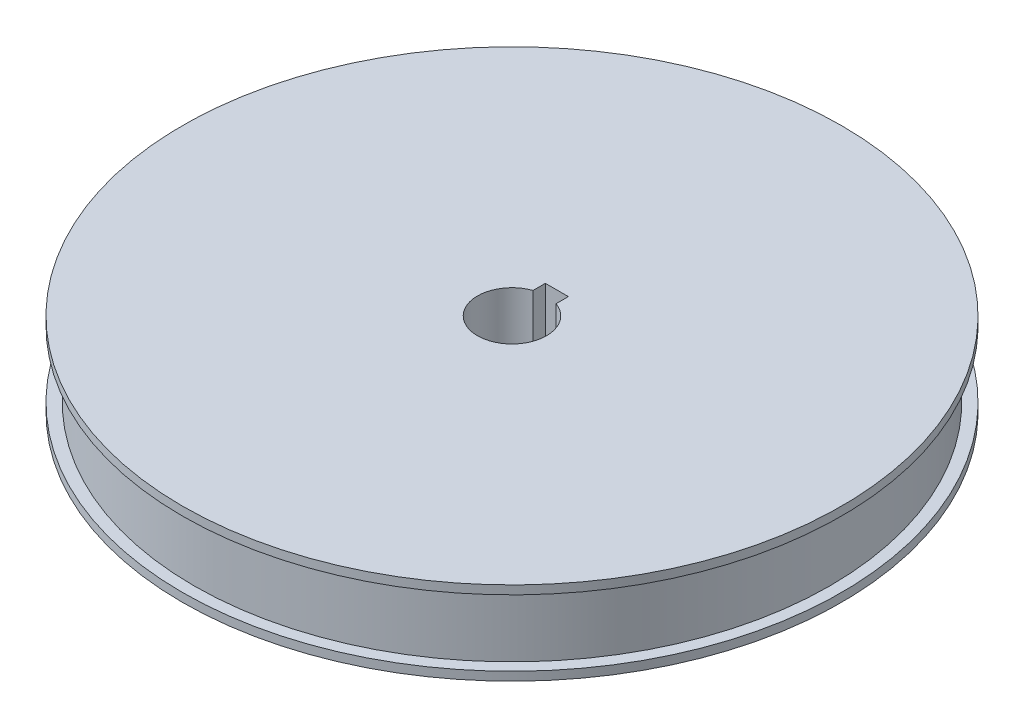
ISO-10303-21;
HEADER;
FILE_DESCRIPTION(('STEP AP214'),'2;1');
FILE_NAME('part.step','',(''),(''),'','','');
FILE_SCHEMA(('AUTOMOTIVE_DESIGN { 1 0 10303 214 1 1 1 1 }'));
ENDSEC;
DATA;
#1=APPLICATION_CONTEXT('core data for automotive mechanical design processes');
#2=APPLICATION_PROTOCOL_DEFINITION('international standard','automotive_design',2000,#1);
#3=PRODUCT_CONTEXT('',#1,'mechanical');
#4=PRODUCT('Part','Part','',(#3));
#5=PRODUCT_RELATED_PRODUCT_CATEGORY('part','',(#4));
#6=PRODUCT_DEFINITION_FORMATION('','',#4);
#7=PRODUCT_DEFINITION_CONTEXT('part definition',#1,'design');
#8=PRODUCT_DEFINITION('design','',#6,#7);
#9=PRODUCT_DEFINITION_SHAPE('','',#8);
#10=(LENGTH_UNIT() NAMED_UNIT(*) SI_UNIT(.MILLI.,.METRE.));
#11=(NAMED_UNIT(*) PLANE_ANGLE_UNIT() SI_UNIT($,.RADIAN.));
#12=(NAMED_UNIT(*) SI_UNIT($,.STERADIAN.) SOLID_ANGLE_UNIT());
#13=UNCERTAINTY_MEASURE_WITH_UNIT(LENGTH_MEASURE(1.E-05),#10,'distance_accuracy_value','');
#14=(GEOMETRIC_REPRESENTATION_CONTEXT(3) GLOBAL_UNCERTAINTY_ASSIGNED_CONTEXT((#13)) GLOBAL_UNIT_ASSIGNED_CONTEXT((#10,
#11,#12)) REPRESENTATION_CONTEXT('',''));
#15=CARTESIAN_POINT('',(0.,0.,0.));
#16=DIRECTION('',(0.,0.,1.));
#17=DIRECTION('',(1.,0.,0.));
#18=AXIS2_PLACEMENT_3D('',#15,#16,#17);
#19=CARTESIAN_POINT('',(0.,10.3155225102178,0.));
#20=DIRECTION('',(0.,1.,0.));
#21=DIRECTION('',(0.,0.,1.));
#22=AXIS2_PLACEMENT_3D('',#19,#20,#21);
#23=CYLINDRICAL_SURFACE('',#22,57.295);
#24=CARTESIAN_POINT('',(0.,-5.75,0.));
#25=DIRECTION('',(0.,1.,0.));
#26=DIRECTION('',(0.,0.,1.));
#27=AXIS2_PLACEMENT_3D('',#24,#25,#26);
#28=CIRCLE('',#27,57.295);
#29=CARTESIAN_POINT('',(0.,-5.75,57.295));
#30=VERTEX_POINT('',#29);
#31=EDGE_CURVE('E117',#30,#30,#28,.T.);
#32=ORIENTED_EDGE('',*,*,#31,.F.);
#33=EDGE_LOOP('',(#32));
#34=FACE_BOUND('',#33,.T.);
#35=CARTESIAN_POINT('',(0.,-7.25,0.));
#36=DIRECTION('',(0.,1.,0.));
#37=DIRECTION('',(0.,0.,1.));
#38=AXIS2_PLACEMENT_3D('',#35,#36,#37);
#39=CIRCLE('',#38,57.295);
#40=CARTESIAN_POINT('',(0.,-7.25,57.295));
#41=VERTEX_POINT('',#40);
#42=EDGE_CURVE('E47',#41,#41,#39,.T.);
#43=ORIENTED_EDGE('',*,*,#42,.T.);
#44=EDGE_LOOP('',(#43));
#45=FACE_BOUND('',#44,.T.);
#46=ADVANCED_FACE('F39',(#34,#45),#23,.T.);
#47=CARTESIAN_POINT('',(0.,-7.25,-57.295));
#48=DIRECTION('',(0.,1.,0.));
#49=DIRECTION('',(0.,0.,1.));
#50=AXIS2_PLACEMENT_3D('',#47,#48,#49);
#51=PLANE('',#50);
#52=ORIENTED_EDGE('',*,*,#42,.F.);
#53=EDGE_LOOP('',(#52));
#54=FACE_BOUND('',#53,.T.);
#55=DIRECTION('',(-1.,0.,0.));
#56=VECTOR('',#55,1.);
#57=CARTESIAN_POINT('',(-2.,-7.25,-7.79999999999999));
#58=LINE('',#57,#56);
#59=CARTESIAN_POINT('',(2.,-7.25,-7.79999999999999));
#60=VERTEX_POINT('',#59);
#61=CARTESIAN_POINT('',(-2.,-7.25,-7.79999999999999));
#62=VERTEX_POINT('',#61);
#63=EDGE_CURVE('E88',#60,#62,#58,.T.);
#64=ORIENTED_EDGE('',*,*,#63,.T.);
#65=DIRECTION('',(0.,0.,1.));
#66=VECTOR('',#65,1.);
#67=CARTESIAN_POINT('',(-2.,-7.25,-3.49999999999999));
#68=LINE('',#67,#66);
#69=CARTESIAN_POINT('',(-2.,-7.25,-5.65685424949238));
#70=VERTEX_POINT('',#69);
#71=EDGE_CURVE('E100',#62,#70,#68,.T.);
#72=ORIENTED_EDGE('',*,*,#71,.T.);
#73=CARTESIAN_POINT('',(0.,-7.24999999999999,0.));
#74=DIRECTION('',(0.,1.,0.));
#75=DIRECTION('',(0.,0.,1.));
#76=AXIS2_PLACEMENT_3D('',#73,#74,#75);
#77=CIRCLE('',#76,6.00000000000001);
#78=CARTESIAN_POINT('',(2.,-7.25,-5.65685424949238));
#79=VERTEX_POINT('',#78);
#80=EDGE_CURVE('E98',#70,#79,#77,.T.);
#81=ORIENTED_EDGE('',*,*,#80,.T.);
#82=DIRECTION('',(0.,0.,-1.));
#83=VECTOR('',#82,1.);
#84=CARTESIAN_POINT('',(2.,-7.25,-3.49999999999999));
#85=LINE('',#84,#83);
#86=EDGE_CURVE('E82',#79,#60,#85,.T.);
#87=ORIENTED_EDGE('',*,*,#86,.T.);
#88=EDGE_LOOP('',(#64,#72,#81,#87));
#89=FACE_BOUND('',#88,.T.);
#90=ADVANCED_FACE('F96',(#54,#89),#51,.F.);
#91=CARTESIAN_POINT('',(0.,10.3155225102178,0.));
#92=DIRECTION('',(0.,1.,0.));
#93=DIRECTION('',(0.,0.,1.));
#94=AXIS2_PLACEMENT_3D('',#91,#92,#93);
#95=CYLINDRICAL_SURFACE('',#94,6.00000000000001);
#96=ORIENTED_EDGE('',*,*,#80,.F.);
#97=DIRECTION('',(0.,1.,0.));
#98=VECTOR('',#97,1.);
#99=CARTESIAN_POINT('',(-2.,10.3155225102178,-5.65685424949238));
#100=LINE('',#99,#98);
#101=CARTESIAN_POINT('',(-2.,7.25,-5.65685424949238));
#102=VERTEX_POINT('',#101);
#103=EDGE_CURVE('E61',#70,#102,#100,.T.);
#104=ORIENTED_EDGE('',*,*,#103,.T.);
#105=CARTESIAN_POINT('',(0.,7.24999999999999,0.));
#106=DIRECTION('',(0.,1.,0.));
#107=DIRECTION('',(0.,0.,1.));
#108=AXIS2_PLACEMENT_3D('',#105,#106,#107);
#109=CIRCLE('',#108,6.00000000000001);
#110=CARTESIAN_POINT('',(2.,7.24999999999999,-5.65685424949238));
#111=VERTEX_POINT('',#110);
#112=EDGE_CURVE('E137',#102,#111,#109,.T.);
#113=ORIENTED_EDGE('',*,*,#112,.T.);
#114=DIRECTION('',(0.,1.,0.));
#115=VECTOR('',#114,1.);
#116=CARTESIAN_POINT('',(2.,10.3155225102178,-5.65685424949238));
#117=LINE('',#116,#115);
#118=EDGE_CURVE('E54',#111,#79,#117,.F.);
#119=ORIENTED_EDGE('',*,*,#118,.T.);
#120=EDGE_LOOP('',(#96,#104,#113,#119));
#121=FACE_BOUND('',#120,.T.);
#122=ADVANCED_FACE('F148',(#121),#95,.F.);
#123=CARTESIAN_POINT('',(0.,7.25,-57.295));
#124=DIRECTION('',(0.,-1.,0.));
#125=DIRECTION('',(0.,0.,-1.));
#126=AXIS2_PLACEMENT_3D('',#123,#124,#125);
#127=PLANE('',#126);
#128=ORIENTED_EDGE('',*,*,#112,.F.);
#129=DIRECTION('',(0.,0.,1.));
#130=VECTOR('',#129,1.);
#131=CARTESIAN_POINT('',(-2.,7.25,-3.49999999999999));
#132=LINE('',#131,#130);
#133=CARTESIAN_POINT('',(-2.,7.25,-7.79999999999999));
#134=VERTEX_POINT('',#133);
#135=EDGE_CURVE('E106',#134,#102,#132,.T.);
#136=ORIENTED_EDGE('',*,*,#135,.F.);
#137=DIRECTION('',(-1.,0.,0.));
#138=VECTOR('',#137,1.);
#139=CARTESIAN_POINT('',(-2.,7.25,-7.79999999999999));
#140=LINE('',#139,#138);
#141=CARTESIAN_POINT('',(2.,7.25,-7.79999999999999));
#142=VERTEX_POINT('',#141);
#143=EDGE_CURVE('E103',#142,#134,#140,.T.);
#144=ORIENTED_EDGE('',*,*,#143,.F.);
#145=DIRECTION('',(0.,0.,1.));
#146=VECTOR('',#145,1.);
#147=CARTESIAN_POINT('',(1.99999999999993,7.25,-57.295));
#148=LINE('',#147,#146);
#149=EDGE_CURVE('E11',#142,#111,#148,.T.);
#150=ORIENTED_EDGE('',*,*,#149,.T.);
#151=EDGE_LOOP('',(#128,#136,#144,#150));
#152=FACE_BOUND('',#151,.T.);
#153=CARTESIAN_POINT('',(0.,7.25,0.));
#154=DIRECTION('',(0.,1.,0.));
#155=DIRECTION('',(0.,0.,1.));
#156=AXIS2_PLACEMENT_3D('',#153,#154,#155);
#157=CIRCLE('',#156,57.295);
#158=CARTESIAN_POINT('',(0.,7.25,57.295));
#159=VERTEX_POINT('',#158);
#160=EDGE_CURVE('E133',#159,#159,#157,.T.);
#161=ORIENTED_EDGE('',*,*,#160,.T.);
#162=EDGE_LOOP('',(#161));
#163=FACE_BOUND('',#162,.T.);
#164=ADVANCED_FACE('F153',(#152,#163),#127,.F.);
#165=CARTESIAN_POINT('',(0.,10.3155225102178,0.));
#166=DIRECTION('',(0.,1.,0.));
#167=DIRECTION('',(0.,0.,1.));
#168=AXIS2_PLACEMENT_3D('',#165,#166,#167);
#169=CYLINDRICAL_SURFACE('',#168,57.295);
#170=ORIENTED_EDGE('',*,*,#160,.F.);
#171=EDGE_LOOP('',(#170));
#172=FACE_BOUND('',#171,.T.);
#173=CARTESIAN_POINT('',(0.,5.75,0.));
#174=DIRECTION('',(0.,1.,0.));
#175=DIRECTION('',(0.,0.,1.));
#176=AXIS2_PLACEMENT_3D('',#173,#174,#175);
#177=CIRCLE('',#176,57.295);
#178=CARTESIAN_POINT('',(0.,5.75,57.295));
#179=VERTEX_POINT('',#178);
#180=EDGE_CURVE('E129',#179,#179,#177,.T.);
#181=ORIENTED_EDGE('',*,*,#180,.T.);
#182=EDGE_LOOP('',(#181));
#183=FACE_BOUND('',#182,.T.);
#184=ADVANCED_FACE('F160',(#172,#183),#169,.T.);
#185=CARTESIAN_POINT('',(0.,5.75,-55.295));
#186=DIRECTION('',(0.,1.,0.));
#187=DIRECTION('',(0.,0.,1.));
#188=AXIS2_PLACEMENT_3D('',#185,#186,#187);
#189=PLANE('',#188);
#190=ORIENTED_EDGE('',*,*,#180,.F.);
#191=EDGE_LOOP('',(#190));
#192=FACE_BOUND('',#191,.T.);
#193=CARTESIAN_POINT('',(0.,5.75,0.));
#194=DIRECTION('',(0.,1.,0.));
#195=DIRECTION('',(0.,0.,1.));
#196=AXIS2_PLACEMENT_3D('',#193,#194,#195);
#197=CIRCLE('',#196,55.295);
#198=CARTESIAN_POINT('',(0.,5.75,55.295));
#199=VERTEX_POINT('',#198);
#200=EDGE_CURVE('E125',#199,#199,#197,.T.);
#201=ORIENTED_EDGE('',*,*,#200,.T.);
#202=EDGE_LOOP('',(#201));
#203=FACE_BOUND('',#202,.T.);
#204=ADVANCED_FACE('F164',(#192,#203),#189,.F.);
#205=CARTESIAN_POINT('',(0.,10.3155225102178,0.));
#206=DIRECTION('',(0.,1.,0.));
#207=DIRECTION('',(0.,0.,1.));
#208=AXIS2_PLACEMENT_3D('',#205,#206,#207);
#209=CYLINDRICAL_SURFACE('',#208,55.295);
#210=ORIENTED_EDGE('',*,*,#200,.F.);
#211=EDGE_LOOP('',(#210));
#212=FACE_BOUND('',#211,.T.);
#213=CARTESIAN_POINT('',(0.,-5.75,0.));
#214=DIRECTION('',(0.,1.,0.));
#215=DIRECTION('',(0.,0.,1.));
#216=AXIS2_PLACEMENT_3D('',#213,#214,#215);
#217=CIRCLE('',#216,55.295);
#218=CARTESIAN_POINT('',(0.,-5.75,55.295));
#219=VERTEX_POINT('',#218);
#220=EDGE_CURVE('E121',#219,#219,#217,.T.);
#221=ORIENTED_EDGE('',*,*,#220,.T.);
#222=EDGE_LOOP('',(#221));
#223=FACE_BOUND('',#222,.T.);
#224=ADVANCED_FACE('F168',(#212,#223),#209,.T.);
#225=CARTESIAN_POINT('',(0.,-5.75,-55.295));
#226=DIRECTION('',(0.,-1.,0.));
#227=DIRECTION('',(0.,0.,-1.));
#228=AXIS2_PLACEMENT_3D('',#225,#226,#227);
#229=PLANE('',#228);
#230=ORIENTED_EDGE('',*,*,#220,.F.);
#231=EDGE_LOOP('',(#230));
#232=FACE_BOUND('',#231,.T.);
#233=ORIENTED_EDGE('',*,*,#31,.T.);
#234=EDGE_LOOP('',(#233));
#235=FACE_BOUND('',#234,.T.);
#236=ADVANCED_FACE('F172',(#232,#235),#229,.F.);
#237=CARTESIAN_POINT('',(-2.,-7.25,-3.49999999999999));
#238=DIRECTION('',(-1.,0.,0.));
#239=DIRECTION('',(0.,0.,1.));
#240=AXIS2_PLACEMENT_3D('',#237,#238,#239);
#241=PLANE('',#240);
#242=ORIENTED_EDGE('',*,*,#71,.F.);
#243=DIRECTION('',(0.,1.,0.));
#244=VECTOR('',#243,1.);
#245=CARTESIAN_POINT('',(-2.,-7.25,-7.79999999999999));
#246=LINE('',#245,#244);
#247=EDGE_CURVE('E87',#62,#134,#246,.T.);
#248=ORIENTED_EDGE('',*,*,#247,.T.);
#249=ORIENTED_EDGE('',*,*,#135,.T.);
#250=ORIENTED_EDGE('',*,*,#103,.F.);
#251=EDGE_LOOP('',(#242,#248,#249,#250));
#252=FACE_BOUND('',#251,.T.);
#253=ADVANCED_FACE('F176',(#252),#241,.F.);
#254=CARTESIAN_POINT('',(2.,-7.25,-3.49999999999999));
#255=DIRECTION('',(1.,0.,0.));
#256=DIRECTION('',(0.,0.,-1.));
#257=AXIS2_PLACEMENT_3D('',#254,#255,#256);
#258=PLANE('',#257);
#259=ORIENTED_EDGE('',*,*,#149,.F.);
#260=DIRECTION('',(0.,1.,0.));
#261=VECTOR('',#260,1.);
#262=CARTESIAN_POINT('',(2.,-7.25,-7.79999999999999));
#263=LINE('',#262,#261);
#264=EDGE_CURVE('E78',#60,#142,#263,.T.);
#265=ORIENTED_EDGE('',*,*,#264,.F.);
#266=ORIENTED_EDGE('',*,*,#86,.F.);
#267=ORIENTED_EDGE('',*,*,#118,.F.);
#268=EDGE_LOOP('',(#259,#265,#266,#267));
#269=FACE_BOUND('',#268,.T.);
#270=ADVANCED_FACE('F80',(#269),#258,.F.);
#271=CARTESIAN_POINT('',(-2.,-7.25,-7.79999999999999));
#272=DIRECTION('',(0.,0.,-1.));
#273=DIRECTION('',(-1.,0.,0.));
#274=AXIS2_PLACEMENT_3D('',#271,#272,#273);
#275=PLANE('',#274);
#276=ORIENTED_EDGE('',*,*,#143,.T.);
#277=ORIENTED_EDGE('',*,*,#247,.F.);
#278=ORIENTED_EDGE('',*,*,#63,.F.);
#279=ORIENTED_EDGE('',*,*,#264,.T.);
#280=EDGE_LOOP('',(#276,#277,#278,#279));
#281=FACE_BOUND('',#280,.T.);
#282=ADVANCED_FACE('F91',(#281),#275,.F.);
#283=CLOSED_SHELL('',(#46,#90,#122,#164,#184,#204,#224,#236,#253,#270,#282));
#284=MANIFOLD_SOLID_BREP('B2',#283);
#285=ADVANCED_BREP_SHAPE_REPRESENTATION('',(#18,#284),#14);
#286=SHAPE_DEFINITION_REPRESENTATION(#9,#285);
ENDSEC;
END-ISO-10303-21;
